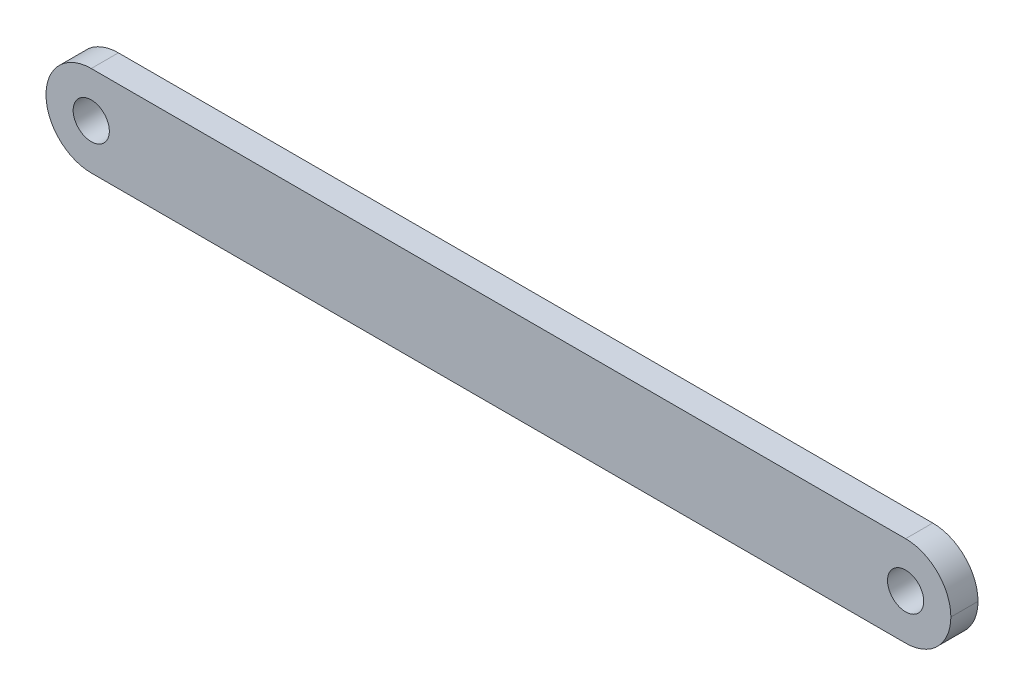
ISO-10303-21;
HEADER;
FILE_DESCRIPTION(('STEP AP214'),'2;1');
FILE_NAME('part.step','',(''),(''),'','','');
FILE_SCHEMA(('AUTOMOTIVE_DESIGN { 1 0 10303 214 1 1 1 1 }'));
ENDSEC;
DATA;
#1=APPLICATION_CONTEXT('core data for automotive mechanical design processes');
#2=APPLICATION_PROTOCOL_DEFINITION('international standard','automotive_design',2000,#1);
#3=PRODUCT_CONTEXT('',#1,'mechanical');
#4=PRODUCT('Part','Part','',(#3));
#5=PRODUCT_RELATED_PRODUCT_CATEGORY('part','',(#4));
#6=PRODUCT_DEFINITION_FORMATION('','',#4);
#7=PRODUCT_DEFINITION_CONTEXT('part definition',#1,'design');
#8=PRODUCT_DEFINITION('design','',#6,#7);
#9=PRODUCT_DEFINITION_SHAPE('','',#8);
#10=(LENGTH_UNIT() NAMED_UNIT(*) SI_UNIT(.MILLI.,.METRE.));
#11=(NAMED_UNIT(*) PLANE_ANGLE_UNIT() SI_UNIT($,.RADIAN.));
#12=(NAMED_UNIT(*) SI_UNIT($,.STERADIAN.) SOLID_ANGLE_UNIT());
#13=UNCERTAINTY_MEASURE_WITH_UNIT(LENGTH_MEASURE(1.E-05),#10,'distance_accuracy_value','');
#14=(GEOMETRIC_REPRESENTATION_CONTEXT(3) GLOBAL_UNCERTAINTY_ASSIGNED_CONTEXT((#13)) GLOBAL_UNIT_ASSIGNED_CONTEXT((#10,
#11,#12)) REPRESENTATION_CONTEXT('',''));
#15=CARTESIAN_POINT('',(0.,0.,0.));
#16=DIRECTION('',(0.,0.,1.));
#17=DIRECTION('',(1.,0.,0.));
#18=AXIS2_PLACEMENT_3D('',#15,#16,#17);
#19=CARTESIAN_POINT('',(0.,0.,3.));
#20=DIRECTION('',(0.,0.,-1.));
#21=DIRECTION('',(-1.,0.,0.));
#22=AXIS2_PLACEMENT_3D('',#19,#20,#21);
#23=PLANE('',#22);
#24=DIRECTION('',(1.,0.,0.));
#25=VECTOR('',#24,1.);
#26=CARTESIAN_POINT('',(-50.,-5.,3.));
#27=LINE('',#26,#25);
#28=CARTESIAN_POINT('',(-45.,-5.,3.));
#29=VERTEX_POINT('',#28);
#30=CARTESIAN_POINT('',(45.,-5.,3.));
#31=VERTEX_POINT('',#30);
#32=EDGE_CURVE('E137',#29,#31,#27,.T.);
#33=ORIENTED_EDGE('',*,*,#32,.T.);
#34=CARTESIAN_POINT('',(45.,0.,3.));
#35=DIRECTION('',(0.,0.,-1.));
#36=DIRECTION('',(-1.,0.,0.));
#37=AXIS2_PLACEMENT_3D('',#34,#35,#36);
#38=CIRCLE('',#37,5.);
#39=CARTESIAN_POINT('',(50.,0.,3.));
#40=VERTEX_POINT('',#39);
#41=EDGE_CURVE('E133',#31,#40,#38,.F.);
#42=ORIENTED_EDGE('',*,*,#41,.T.);
#43=CARTESIAN_POINT('',(45.,0.,3.));
#44=DIRECTION('',(0.,0.,-1.));
#45=DIRECTION('',(-1.,0.,0.));
#46=AXIS2_PLACEMENT_3D('',#43,#44,#45);
#47=CIRCLE('',#46,5.);
#48=CARTESIAN_POINT('',(45.,5.,3.));
#49=VERTEX_POINT('',#48);
#50=EDGE_CURVE('E114',#40,#49,#47,.F.);
#51=ORIENTED_EDGE('',*,*,#50,.T.);
#52=DIRECTION('',(-1.,0.,0.));
#53=VECTOR('',#52,1.);
#54=CARTESIAN_POINT('',(-50.,5.,3.));
#55=LINE('',#54,#53);
#56=CARTESIAN_POINT('',(-45.,5.,3.));
#57=VERTEX_POINT('',#56);
#58=EDGE_CURVE('E143',#49,#57,#55,.T.);
#59=ORIENTED_EDGE('',*,*,#58,.T.);
#60=CARTESIAN_POINT('',(-45.,0.,3.));
#61=DIRECTION('',(0.,0.,-1.));
#62=DIRECTION('',(-1.,0.,0.));
#63=AXIS2_PLACEMENT_3D('',#60,#61,#62);
#64=CIRCLE('',#63,5.);
#65=CARTESIAN_POINT('',(-50.,0.,3.));
#66=VERTEX_POINT('',#65);
#67=EDGE_CURVE('E59',#57,#66,#64,.F.);
#68=ORIENTED_EDGE('',*,*,#67,.T.);
#69=CARTESIAN_POINT('',(-45.,0.,3.));
#70=DIRECTION('',(0.,0.,-1.));
#71=DIRECTION('',(-1.,0.,0.));
#72=AXIS2_PLACEMENT_3D('',#69,#70,#71);
#73=CIRCLE('',#72,5.);
#74=EDGE_CURVE('E126',#66,#29,#73,.F.);
#75=ORIENTED_EDGE('',*,*,#74,.T.);
#76=EDGE_LOOP('',(#33,#42,#51,#59,#68,#75));
#77=FACE_BOUND('',#76,.T.);
#78=CARTESIAN_POINT('',(-45.,0.,3.));
#79=DIRECTION('',(0.,0.,1.));
#80=DIRECTION('',(1.,0.,0.));
#81=AXIS2_PLACEMENT_3D('',#78,#79,#80);
#82=CIRCLE('',#81,2.);
#83=CARTESIAN_POINT('',(-43.,0.,3.));
#84=VERTEX_POINT('',#83);
#85=EDGE_CURVE('E145',#84,#84,#82,.T.);
#86=ORIENTED_EDGE('',*,*,#85,.F.);
#87=EDGE_LOOP('',(#86));
#88=FACE_BOUND('',#87,.T.);
#89=CARTESIAN_POINT('',(45.,0.,3.));
#90=DIRECTION('',(0.,0.,1.));
#91=DIRECTION('',(1.,0.,0.));
#92=AXIS2_PLACEMENT_3D('',#89,#90,#91);
#93=CIRCLE('',#92,2.);
#94=CARTESIAN_POINT('',(47.,0.,3.));
#95=VERTEX_POINT('',#94);
#96=EDGE_CURVE('E186',#95,#95,#93,.T.);
#97=ORIENTED_EDGE('',*,*,#96,.F.);
#98=EDGE_LOOP('',(#97));
#99=FACE_BOUND('',#98,.T.);
#100=ADVANCED_FACE('F41',(#77,#88,#99),#23,.F.);
#101=CARTESIAN_POINT('',(0.,0.,0.));
#102=DIRECTION('',(0.,0.,-1.));
#103=DIRECTION('',(-1.,0.,0.));
#104=AXIS2_PLACEMENT_3D('',#101,#102,#103);
#105=PLANE('',#104);
#106=CARTESIAN_POINT('',(-45.,0.,0.));
#107=DIRECTION('',(0.,0.,1.));
#108=DIRECTION('',(1.,0.,0.));
#109=AXIS2_PLACEMENT_3D('',#106,#107,#108);
#110=CIRCLE('',#109,2.);
#111=CARTESIAN_POINT('',(-43.,0.,0.));
#112=VERTEX_POINT('',#111);
#113=EDGE_CURVE('E191',#112,#112,#110,.T.);
#114=ORIENTED_EDGE('',*,*,#113,.T.);
#115=EDGE_LOOP('',(#114));
#116=FACE_BOUND('',#115,.T.);
#117=CARTESIAN_POINT('',(45.,0.,0.));
#118=DIRECTION('',(0.,0.,-1.));
#119=DIRECTION('',(-1.,0.,0.));
#120=AXIS2_PLACEMENT_3D('',#117,#118,#119);
#121=CIRCLE('',#120,5.);
#122=CARTESIAN_POINT('',(45.,5.,0.));
#123=VERTEX_POINT('',#122);
#124=CARTESIAN_POINT('',(50.,0.,0.));
#125=VERTEX_POINT('',#124);
#126=EDGE_CURVE('E96',#123,#125,#121,.T.);
#127=ORIENTED_EDGE('',*,*,#126,.T.);
#128=CARTESIAN_POINT('',(45.,0.,0.));
#129=DIRECTION('',(0.,0.,-1.));
#130=DIRECTION('',(-1.,0.,0.));
#131=AXIS2_PLACEMENT_3D('',#128,#129,#130);
#132=CIRCLE('',#131,5.);
#133=CARTESIAN_POINT('',(45.,-5.,0.));
#134=VERTEX_POINT('',#133);
#135=EDGE_CURVE('E105',#125,#134,#132,.T.);
#136=ORIENTED_EDGE('',*,*,#135,.T.);
#137=DIRECTION('',(1.,0.,0.));
#138=VECTOR('',#137,1.);
#139=CARTESIAN_POINT('',(-50.,-5.,0.));
#140=LINE('',#139,#138);
#141=CARTESIAN_POINT('',(-45.,-5.,0.));
#142=VERTEX_POINT('',#141);
#143=EDGE_CURVE('E138',#142,#134,#140,.T.);
#144=ORIENTED_EDGE('',*,*,#143,.F.);
#145=CARTESIAN_POINT('',(-45.,0.,0.));
#146=DIRECTION('',(0.,0.,-1.));
#147=DIRECTION('',(-1.,0.,0.));
#148=AXIS2_PLACEMENT_3D('',#145,#146,#147);
#149=CIRCLE('',#148,5.);
#150=CARTESIAN_POINT('',(-50.,0.,0.));
#151=VERTEX_POINT('',#150);
#152=EDGE_CURVE('E110',#142,#151,#149,.T.);
#153=ORIENTED_EDGE('',*,*,#152,.T.);
#154=CARTESIAN_POINT('',(-45.,0.,0.));
#155=DIRECTION('',(0.,0.,-1.));
#156=DIRECTION('',(-1.,0.,0.));
#157=AXIS2_PLACEMENT_3D('',#154,#155,#156);
#158=CIRCLE('',#157,5.);
#159=CARTESIAN_POINT('',(-45.,5.,0.));
#160=VERTEX_POINT('',#159);
#161=EDGE_CURVE('E146',#151,#160,#158,.T.);
#162=ORIENTED_EDGE('',*,*,#161,.T.);
#163=DIRECTION('',(-1.,0.,0.));
#164=VECTOR('',#163,1.);
#165=CARTESIAN_POINT('',(-50.,5.,0.));
#166=LINE('',#165,#164);
#167=EDGE_CURVE('E102',#123,#160,#166,.T.);
#168=ORIENTED_EDGE('',*,*,#167,.F.);
#169=EDGE_LOOP('',(#127,#136,#144,#153,#162,#168));
#170=FACE_BOUND('',#169,.T.);
#171=CARTESIAN_POINT('',(45.,0.,0.));
#172=DIRECTION('',(0.,0.,1.));
#173=DIRECTION('',(1.,0.,0.));
#174=AXIS2_PLACEMENT_3D('',#171,#172,#173);
#175=CIRCLE('',#174,2.);
#176=CARTESIAN_POINT('',(47.,0.,0.));
#177=VERTEX_POINT('',#176);
#178=EDGE_CURVE('E113',#177,#177,#175,.T.);
#179=ORIENTED_EDGE('',*,*,#178,.T.);
#180=EDGE_LOOP('',(#179));
#181=FACE_BOUND('',#180,.T.);
#182=ADVANCED_FACE('F98',(#116,#170,#181),#105,.T.);
#183=CARTESIAN_POINT('',(-50.,5.,3.));
#184=DIRECTION('',(0.,-1.,0.));
#185=DIRECTION('',(0.,0.,-1.));
#186=AXIS2_PLACEMENT_3D('',#183,#184,#185);
#187=PLANE('',#186);
#188=ORIENTED_EDGE('',*,*,#58,.F.);
#189=DIRECTION('',(0.,0.,-1.));
#190=VECTOR('',#189,1.);
#191=CARTESIAN_POINT('',(45.,5.,3.));
#192=LINE('',#191,#190);
#193=EDGE_CURVE('E11',#49,#123,#192,.T.);
#194=ORIENTED_EDGE('',*,*,#193,.T.);
#195=ORIENTED_EDGE('',*,*,#167,.T.);
#196=DIRECTION('',(0.,0.,-1.));
#197=VECTOR('',#196,1.);
#198=CARTESIAN_POINT('',(-45.,5.,3.));
#199=LINE('',#198,#197);
#200=EDGE_CURVE('E49',#160,#57,#199,.F.);
#201=ORIENTED_EDGE('',*,*,#200,.T.);
#202=EDGE_LOOP('',(#188,#194,#195,#201));
#203=FACE_BOUND('',#202,.T.);
#204=ADVANCED_FACE('F167',(#203),#187,.F.);
#205=CARTESIAN_POINT('',(-50.,-5.,3.));
#206=DIRECTION('',(0.,1.,0.));
#207=DIRECTION('',(0.,0.,1.));
#208=AXIS2_PLACEMENT_3D('',#205,#206,#207);
#209=PLANE('',#208);
#210=ORIENTED_EDGE('',*,*,#143,.T.);
#211=DIRECTION('',(0.,0.,-1.));
#212=VECTOR('',#211,1.);
#213=CARTESIAN_POINT('',(45.,-5.,3.));
#214=LINE('',#213,#212);
#215=EDGE_CURVE('E120',#134,#31,#214,.F.);
#216=ORIENTED_EDGE('',*,*,#215,.T.);
#217=ORIENTED_EDGE('',*,*,#32,.F.);
#218=DIRECTION('',(0.,0.,-1.));
#219=VECTOR('',#218,1.);
#220=CARTESIAN_POINT('',(-45.,-5.,3.));
#221=LINE('',#220,#219);
#222=EDGE_CURVE('E116',#29,#142,#221,.T.);
#223=ORIENTED_EDGE('',*,*,#222,.T.);
#224=EDGE_LOOP('',(#210,#216,#217,#223));
#225=FACE_BOUND('',#224,.T.);
#226=ADVANCED_FACE('F140',(#225),#209,.F.);
#227=CARTESIAN_POINT('',(-45.,0.,3.));
#228=DIRECTION('',(0.,0.,-1.));
#229=DIRECTION('',(-1.,0.,0.));
#230=AXIS2_PLACEMENT_3D('',#227,#228,#229);
#231=CYLINDRICAL_SURFACE('',#230,2.);
#232=ORIENTED_EDGE('',*,*,#85,.T.);
#233=EDGE_LOOP('',(#232));
#234=FACE_BOUND('',#233,.T.);
#235=ORIENTED_EDGE('',*,*,#113,.F.);
#236=EDGE_LOOP('',(#235));
#237=FACE_BOUND('',#236,.T.);
#238=ADVANCED_FACE('F168',(#234,#237),#231,.F.);
#239=CARTESIAN_POINT('',(45.,0.,3.));
#240=DIRECTION('',(0.,0.,-1.));
#241=DIRECTION('',(-1.,0.,0.));
#242=AXIS2_PLACEMENT_3D('',#239,#240,#241);
#243=CYLINDRICAL_SURFACE('',#242,2.);
#244=ORIENTED_EDGE('',*,*,#96,.T.);
#245=EDGE_LOOP('',(#244));
#246=FACE_BOUND('',#245,.T.);
#247=ORIENTED_EDGE('',*,*,#178,.F.);
#248=EDGE_LOOP('',(#247));
#249=FACE_BOUND('',#248,.T.);
#250=ADVANCED_FACE('F176',(#246,#249),#243,.F.);
#251=CARTESIAN_POINT('',(45.,0.,3.));
#252=DIRECTION('',(0.,0.,-1.));
#253=DIRECTION('',(-1.,0.,0.));
#254=AXIS2_PLACEMENT_3D('',#251,#252,#253);
#255=CYLINDRICAL_SURFACE('',#254,5.);
#256=ORIENTED_EDGE('',*,*,#193,.F.);
#257=ORIENTED_EDGE('',*,*,#50,.F.);
#258=DIRECTION('',(0.,0.,-1.));
#259=VECTOR('',#258,1.);
#260=CARTESIAN_POINT('',(50.,0.,3.));
#261=LINE('',#260,#259);
#262=EDGE_CURVE('E112',#125,#40,#261,.F.);
#263=ORIENTED_EDGE('',*,*,#262,.F.);
#264=ORIENTED_EDGE('',*,*,#126,.F.);
#265=EDGE_LOOP('',(#256,#257,#263,#264));
#266=FACE_BOUND('',#265,.T.);
#267=ADVANCED_FACE('F115',(#266),#255,.T.);
#268=CARTESIAN_POINT('',(45.,0.,3.));
#269=DIRECTION('',(0.,0.,-1.));
#270=DIRECTION('',(-1.,0.,0.));
#271=AXIS2_PLACEMENT_3D('',#268,#269,#270);
#272=CYLINDRICAL_SURFACE('',#271,5.);
#273=ORIENTED_EDGE('',*,*,#41,.F.);
#274=ORIENTED_EDGE('',*,*,#215,.F.);
#275=ORIENTED_EDGE('',*,*,#135,.F.);
#276=ORIENTED_EDGE('',*,*,#262,.T.);
#277=EDGE_LOOP('',(#273,#274,#275,#276));
#278=FACE_BOUND('',#277,.T.);
#279=ADVANCED_FACE('F119',(#278),#272,.T.);
#280=CARTESIAN_POINT('',(-45.,0.,3.));
#281=DIRECTION('',(0.,0.,-1.));
#282=DIRECTION('',(-1.,0.,0.));
#283=AXIS2_PLACEMENT_3D('',#280,#281,#282);
#284=CYLINDRICAL_SURFACE('',#283,5.);
#285=DIRECTION('',(0.,0.,-1.));
#286=VECTOR('',#285,1.);
#287=CARTESIAN_POINT('',(-50.,0.,3.));
#288=LINE('',#287,#286);
#289=EDGE_CURVE('E44',#66,#151,#288,.T.);
#290=ORIENTED_EDGE('',*,*,#289,.F.);
#291=ORIENTED_EDGE('',*,*,#67,.F.);
#292=ORIENTED_EDGE('',*,*,#200,.F.);
#293=ORIENTED_EDGE('',*,*,#161,.F.);
#294=EDGE_LOOP('',(#290,#291,#292,#293));
#295=FACE_BOUND('',#294,.T.);
#296=ADVANCED_FACE('F43',(#295),#284,.T.);
#297=CARTESIAN_POINT('',(-45.,0.,3.));
#298=DIRECTION('',(0.,0.,-1.));
#299=DIRECTION('',(-1.,0.,0.));
#300=AXIS2_PLACEMENT_3D('',#297,#298,#299);
#301=CYLINDRICAL_SURFACE('',#300,5.);
#302=ORIENTED_EDGE('',*,*,#74,.F.);
#303=ORIENTED_EDGE('',*,*,#289,.T.);
#304=ORIENTED_EDGE('',*,*,#152,.F.);
#305=ORIENTED_EDGE('',*,*,#222,.F.);
#306=EDGE_LOOP('',(#302,#303,#304,#305));
#307=FACE_BOUND('',#306,.T.);
#308=ADVANCED_FACE('F152',(#307),#301,.T.);
#309=CLOSED_SHELL('',(#100,#182,#204,#226,#238,#250,#267,#279,#296,#308));
#310=MANIFOLD_SOLID_BREP('B2',#309);
#311=ADVANCED_BREP_SHAPE_REPRESENTATION('',(#18,#310),#14);
#312=SHAPE_DEFINITION_REPRESENTATION(#9,#311);
ENDSEC;
END-ISO-10303-21;
